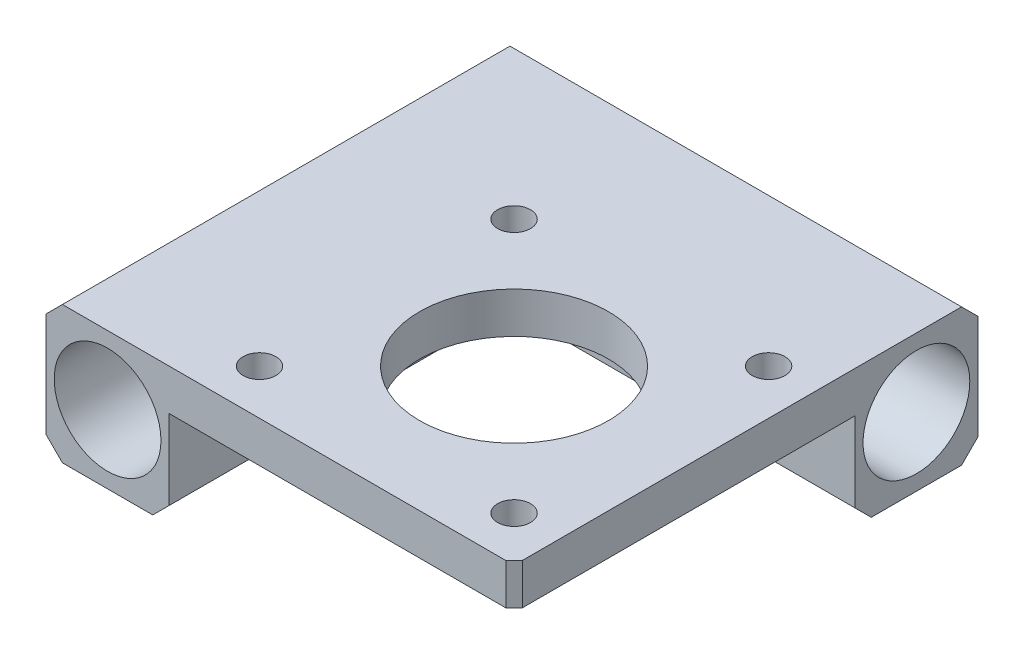
ISO-10303-21;
HEADER;
FILE_DESCRIPTION(('STEP AP214'),'2;1');
FILE_NAME('part.step','',(''),(''),'','','');
FILE_SCHEMA(('AUTOMOTIVE_DESIGN { 1 0 10303 214 1 1 1 1 }'));
ENDSEC;
DATA;
#1=APPLICATION_CONTEXT('core data for automotive mechanical design processes');
#2=APPLICATION_PROTOCOL_DEFINITION('international standard','automotive_design',2000,#1);
#3=PRODUCT_CONTEXT('',#1,'mechanical');
#4=PRODUCT('Part','Part','',(#3));
#5=PRODUCT_RELATED_PRODUCT_CATEGORY('part','',(#4));
#6=PRODUCT_DEFINITION_FORMATION('','',#4);
#7=PRODUCT_DEFINITION_CONTEXT('part definition',#1,'design');
#8=PRODUCT_DEFINITION('design','',#6,#7);
#9=PRODUCT_DEFINITION_SHAPE('','',#8);
#10=(LENGTH_UNIT() NAMED_UNIT(*) SI_UNIT(.MILLI.,.METRE.));
#11=(NAMED_UNIT(*) PLANE_ANGLE_UNIT() SI_UNIT($,.RADIAN.));
#12=(NAMED_UNIT(*) SI_UNIT($,.STERADIAN.) SOLID_ANGLE_UNIT());
#13=UNCERTAINTY_MEASURE_WITH_UNIT(LENGTH_MEASURE(1.E-05),#10,'distance_accuracy_value','');
#14=(GEOMETRIC_REPRESENTATION_CONTEXT(3) GLOBAL_UNCERTAINTY_ASSIGNED_CONTEXT((#13)) GLOBAL_UNIT_ASSIGNED_CONTEXT((#10,
#11,#12)) REPRESENTATION_CONTEXT('',''));
#15=CARTESIAN_POINT('',(0.,0.,0.));
#16=DIRECTION('',(0.,0.,1.));
#17=DIRECTION('',(1.,0.,0.));
#18=AXIS2_PLACEMENT_3D('',#15,#16,#17);
#19=CARTESIAN_POINT('',(0.,11.7,0.));
#20=DIRECTION('',(0.,1.,0.));
#21=DIRECTION('',(0.,0.,1.));
#22=AXIS2_PLACEMENT_3D('',#19,#20,#21);
#23=PLANE('',#22);
#24=CARTESIAN_POINT('',(28.5,11.7,15.5));
#25=DIRECTION('',(0.,1.,0.));
#26=DIRECTION('',(0.,0.,1.));
#27=AXIS2_PLACEMENT_3D('',#24,#25,#26);
#28=CIRCLE('',#27,11.5);
#29=CARTESIAN_POINT('',(28.5,11.7,27.));
#30=VERTEX_POINT('',#29);
#31=EDGE_CURVE('E266',#30,#30,#28,.T.);
#32=ORIENTED_EDGE('',*,*,#31,.T.);
#33=EDGE_LOOP('',(#32));
#34=FACE_BOUND('',#33,.T.);
#35=CARTESIAN_POINT('',(44.,11.7,31.));
#36=DIRECTION('',(0.,1.,0.));
#37=DIRECTION('',(0.,0.,1.));
#38=AXIS2_PLACEMENT_3D('',#35,#36,#37);
#39=CIRCLE('',#38,2.);
#40=CARTESIAN_POINT('',(44.,11.7,33.));
#41=VERTEX_POINT('',#40);
#42=EDGE_CURVE('E252',#41,#41,#39,.T.);
#43=ORIENTED_EDGE('',*,*,#42,.T.);
#44=EDGE_LOOP('',(#43));
#45=FACE_BOUND('',#44,.T.);
#46=CARTESIAN_POINT('',(13.,11.7,0.));
#47=DIRECTION('',(0.,1.,0.));
#48=DIRECTION('',(0.,0.,1.));
#49=AXIS2_PLACEMENT_3D('',#46,#47,#48);
#50=CIRCLE('',#49,2.);
#51=CARTESIAN_POINT('',(13.,11.7,2.));
#52=VERTEX_POINT('',#51);
#53=EDGE_CURVE('E249',#52,#52,#50,.T.);
#54=ORIENTED_EDGE('',*,*,#53,.T.);
#55=EDGE_LOOP('',(#54));
#56=FACE_BOUND('',#55,.T.);
#57=CARTESIAN_POINT('',(13.,11.7,31.));
#58=DIRECTION('',(0.,1.,0.));
#59=DIRECTION('',(0.,0.,1.));
#60=AXIS2_PLACEMENT_3D('',#57,#58,#59);
#61=CIRCLE('',#60,2.);
#62=CARTESIAN_POINT('',(13.,11.7,33.));
#63=VERTEX_POINT('',#62);
#64=EDGE_CURVE('E246',#63,#63,#61,.T.);
#65=ORIENTED_EDGE('',*,*,#64,.T.);
#66=EDGE_LOOP('',(#65));
#67=FACE_BOUND('',#66,.T.);
#68=CARTESIAN_POINT('',(44.,11.7,0.));
#69=DIRECTION('',(0.,1.,0.));
#70=DIRECTION('',(0.,0.,1.));
#71=AXIS2_PLACEMENT_3D('',#68,#69,#70);
#72=CIRCLE('',#71,2.);
#73=CARTESIAN_POINT('',(44.,11.7,2.));
#74=VERTEX_POINT('',#73);
#75=EDGE_CURVE('E243',#74,#74,#72,.T.);
#76=ORIENTED_EDGE('',*,*,#75,.T.);
#77=EDGE_LOOP('',(#76));
#78=FACE_BOUND('',#77,.T.);
#79=DIRECTION('',(1.,0.,0.));
#80=VECTOR('',#79,1.);
#81=CARTESIAN_POINT('',(0.,11.7,-5.));
#82=LINE('',#81,#80);
#83=CARTESIAN_POINT('',(9.5,11.7,-5.));
#84=VERTEX_POINT('',#83);
#85=CARTESIAN_POINT('',(49.5,11.7,-5.));
#86=VERTEX_POINT('',#85);
#87=EDGE_CURVE('E260',#84,#86,#82,.T.);
#88=ORIENTED_EDGE('',*,*,#87,.T.);
#89=DIRECTION('',(0.,0.,-1.));
#90=VECTOR('',#89,1.);
#91=CARTESIAN_POINT('',(49.5,11.7,0.));
#92=LINE('',#91,#90);
#93=CARTESIAN_POINT('',(49.5,11.7,35.5));
#94=VERTEX_POINT('',#93);
#95=EDGE_CURVE('E258',#94,#86,#92,.T.);
#96=ORIENTED_EDGE('',*,*,#95,.F.);
#97=DIRECTION('',(0.707106781186548,0.,-0.707106781186548));
#98=VECTOR('',#97,1.);
#99=CARTESIAN_POINT('',(48.5,11.7,36.5));
#100=LINE('',#99,#98);
#101=CARTESIAN_POINT('',(48.5,11.7,36.5));
#102=VERTEX_POINT('',#101);
#103=EDGE_CURVE('E14',#94,#102,#100,.F.);
#104=ORIENTED_EDGE('',*,*,#103,.T.);
#105=DIRECTION('',(1.,0.,0.));
#106=VECTOR('',#105,1.);
#107=CARTESIAN_POINT('',(0.,11.7,36.5));
#108=LINE('',#107,#106);
#109=CARTESIAN_POINT('',(7.5,11.7,36.5));
#110=VERTEX_POINT('',#109);
#111=EDGE_CURVE('E255',#110,#102,#108,.T.);
#112=ORIENTED_EDGE('',*,*,#111,.F.);
#113=DIRECTION('',(0.,0.,-1.));
#114=VECTOR('',#113,1.);
#115=CARTESIAN_POINT('',(7.5,11.7,0.));
#116=LINE('',#115,#114);
#117=CARTESIAN_POINT('',(7.5,11.7,-3.));
#118=VERTEX_POINT('',#117);
#119=EDGE_CURVE('E264',#110,#118,#116,.T.);
#120=ORIENTED_EDGE('',*,*,#119,.T.);
#121=DIRECTION('',(0.707106781186548,0.,-0.707106781186548));
#122=VECTOR('',#121,1.);
#123=CARTESIAN_POINT('',(2.25,11.7,2.25));
#124=LINE('',#123,#122);
#125=EDGE_CURVE('E262',#118,#84,#124,.T.);
#126=ORIENTED_EDGE('',*,*,#125,.T.);
#127=EDGE_LOOP('',(#88,#96,#104,#112,#120,#126));
#128=FACE_BOUND('',#127,.T.);
#129=ADVANCED_FACE('F57',(#34,#45,#56,#67,#78,#128),#23,.F.);
#130=CARTESIAN_POINT('',(7.5,16.7,0.));
#131=DIRECTION('',(-1.,0.,0.));
#132=DIRECTION('',(0.,0.,1.));
#133=AXIS2_PLACEMENT_3D('',#130,#131,#132);
#134=PLANE('',#133);
#135=DIRECTION('',(0.,1.,0.));
#136=VECTOR('',#135,1.);
#137=CARTESIAN_POINT('',(7.5,16.7,-3.));
#138=LINE('',#137,#136);
#139=CARTESIAN_POINT('',(7.5,2.,-3.));
#140=VERTEX_POINT('',#139);
#141=EDGE_CURVE('E326',#140,#118,#138,.T.);
#142=ORIENTED_EDGE('',*,*,#141,.T.);
#143=ORIENTED_EDGE('',*,*,#119,.F.);
#144=DIRECTION('',(0.,1.,0.));
#145=VECTOR('',#144,1.);
#146=CARTESIAN_POINT('',(7.5,2.,36.5));
#147=LINE('',#146,#145);
#148=CARTESIAN_POINT('',(7.5,2.,36.5));
#149=VERTEX_POINT('',#148);
#150=EDGE_CURVE('E222',#149,#110,#147,.T.);
#151=ORIENTED_EDGE('',*,*,#150,.F.);
#152=DIRECTION('',(0.,0.,-1.));
#153=VECTOR('',#152,1.);
#154=CARTESIAN_POINT('',(7.5,2.,0.));
#155=LINE('',#154,#153);
#156=EDGE_CURVE('E329',#149,#140,#155,.T.);
#157=ORIENTED_EDGE('',*,*,#156,.T.);
#158=EDGE_LOOP('',(#142,#143,#151,#157));
#159=FACE_BOUND('',#158,.T.);
#160=ADVANCED_FACE('F427',(#159),#134,.F.);
#161=CARTESIAN_POINT('',(0.,16.7,-5.));
#162=DIRECTION('',(0.,0.,-1.));
#163=DIRECTION('',(-1.,0.,0.));
#164=AXIS2_PLACEMENT_3D('',#161,#162,#163);
#165=PLANE('',#164);
#166=ORIENTED_EDGE('',*,*,#87,.F.);
#167=DIRECTION('',(0.,-1.,0.));
#168=VECTOR('',#167,1.);
#169=CARTESIAN_POINT('',(9.5,0.,-5.));
#170=LINE('',#169,#168);
#171=CARTESIAN_POINT('',(9.5,2.,-5.));
#172=VERTEX_POINT('',#171);
#173=EDGE_CURVE('E332',#84,#172,#170,.T.);
#174=ORIENTED_EDGE('',*,*,#173,.T.);
#175=DIRECTION('',(1.,0.,0.));
#176=VECTOR('',#175,1.);
#177=CARTESIAN_POINT('',(0.,2.,-5.));
#178=LINE('',#177,#176);
#179=CARTESIAN_POINT('',(49.5,2.,-5.));
#180=VERTEX_POINT('',#179);
#181=EDGE_CURVE('E334',#172,#180,#178,.T.);
#182=ORIENTED_EDGE('',*,*,#181,.T.);
#183=DIRECTION('',(0.,-1.,0.));
#184=VECTOR('',#183,1.);
#185=CARTESIAN_POINT('',(49.5,15.7,-5.));
#186=LINE('',#185,#184);
#187=EDGE_CURVE('E218',#86,#180,#186,.T.);
#188=ORIENTED_EDGE('',*,*,#187,.F.);
#189=EDGE_LOOP('',(#166,#174,#182,#188));
#190=FACE_BOUND('',#189,.T.);
#191=ADVANCED_FACE('F433',(#190),#165,.F.);
#192=CARTESIAN_POINT('',(9.5,16.7,-5.));
#193=DIRECTION('',(0.707106781186548,0.,0.707106781186548));
#194=DIRECTION('',(0.,1.,0.));
#195=AXIS2_PLACEMENT_3D('',#192,#193,#194);
#196=PLANE('',#195);
#197=ORIENTED_EDGE('',*,*,#125,.F.);
#198=ORIENTED_EDGE('',*,*,#141,.F.);
#199=DIRECTION('',(0.707106781186548,0.,-0.707106781186548));
#200=VECTOR('',#199,1.);
#201=CARTESIAN_POINT('',(9.5,2.,-5.));
#202=LINE('',#201,#200);
#203=EDGE_CURVE('E347',#172,#140,#202,.F.);
#204=ORIENTED_EDGE('',*,*,#203,.F.);
#205=ORIENTED_EDGE('',*,*,#173,.F.);
#206=EDGE_LOOP('',(#197,#198,#204,#205));
#207=FACE_BOUND('',#206,.T.);
#208=ADVANCED_FACE('F432',(#207),#196,.T.);
#209=CARTESIAN_POINT('',(0.,0.,0.));
#210=DIRECTION('',(0.,1.,0.));
#211=DIRECTION('',(0.,0.,1.));
#212=AXIS2_PLACEMENT_3D('',#209,#210,#211);
#213=PLANE('',#212);
#214=DIRECTION('',(0.,0.,1.));
#215=VECTOR('',#214,1.);
#216=CARTESIAN_POINT('',(5.5,0.,0.));
#217=LINE('',#216,#215);
#218=CARTESIAN_POINT('',(5.5,0.,-3.));
#219=VERTEX_POINT('',#218);
#220=CARTESIAN_POINT('',(5.5,0.,36.5));
#221=VERTEX_POINT('',#220);
#222=EDGE_CURVE('E311',#219,#221,#217,.T.);
#223=ORIENTED_EDGE('',*,*,#222,.T.);
#224=DIRECTION('',(1.,0.,0.));
#225=VECTOR('',#224,1.);
#226=CARTESIAN_POINT('',(-5.5,0.,36.5));
#227=LINE('',#226,#225);
#228=CARTESIAN_POINT('',(-5.5,0.,36.5));
#229=VERTEX_POINT('',#228);
#230=EDGE_CURVE('E228',#229,#221,#227,.T.);
#231=ORIENTED_EDGE('',*,*,#230,.F.);
#232=DIRECTION('',(0.,0.,-1.));
#233=VECTOR('',#232,1.);
#234=CARTESIAN_POINT('',(-5.49999999999999,0.,-20.));
#235=LINE('',#234,#233);
#236=CARTESIAN_POINT('',(-5.49999999999999,0.,-9.03589838486224));
#237=VERTEX_POINT('',#236);
#238=EDGE_CURVE('E313',#229,#237,#235,.T.);
#239=ORIENTED_EDGE('',*,*,#238,.T.);
#240=CARTESIAN_POINT('',(0.,0.,-12.5));
#241=DIRECTION('',(0.,-1.,0.));
#242=DIRECTION('',(0.,0.,-1.));
#243=AXIS2_PLACEMENT_3D('',#240,#241,#242);
#244=CIRCLE('',#243,6.5);
#245=CARTESIAN_POINT('',(3.46410161513776,0.,-18.));
#246=VERTEX_POINT('',#245);
#247=EDGE_CURVE('E284',#246,#237,#244,.T.);
#248=ORIENTED_EDGE('',*,*,#247,.F.);
#249=DIRECTION('',(1.,0.,0.));
#250=VECTOR('',#249,1.);
#251=CARTESIAN_POINT('',(17.5,0.,-18.));
#252=LINE('',#251,#250);
#253=CARTESIAN_POINT('',(49.5,0.,-18.));
#254=VERTEX_POINT('',#253);
#255=EDGE_CURVE('E297',#246,#254,#252,.T.);
#256=ORIENTED_EDGE('',*,*,#255,.T.);
#257=DIRECTION('',(0.,0.,-1.));
#258=VECTOR('',#257,1.);
#259=CARTESIAN_POINT('',(49.5,0.,-7.));
#260=LINE('',#259,#258);
#261=CARTESIAN_POINT('',(49.5,0.,-7.));
#262=VERTEX_POINT('',#261);
#263=EDGE_CURVE('E212',#262,#254,#260,.T.);
#264=ORIENTED_EDGE('',*,*,#263,.F.);
#265=DIRECTION('',(-1.,0.,0.));
#266=VECTOR('',#265,1.);
#267=CARTESIAN_POINT('',(0.,0.,-7.));
#268=LINE('',#267,#266);
#269=CARTESIAN_POINT('',(9.5,0.,-7.));
#270=VERTEX_POINT('',#269);
#271=EDGE_CURVE('E309',#262,#270,#268,.T.);
#272=ORIENTED_EDGE('',*,*,#271,.T.);
#273=DIRECTION('',(0.707106781186548,0.,-0.707106781186548));
#274=VECTOR('',#273,1.);
#275=CARTESIAN_POINT('',(9.5,0.,-7.));
#276=LINE('',#275,#274);
#277=CARTESIAN_POINT('',(7.5,0.,-5.));
#278=VERTEX_POINT('',#277);
#279=EDGE_CURVE('E303',#278,#270,#276,.T.);
#280=ORIENTED_EDGE('',*,*,#279,.F.);
#281=DIRECTION('',(0.707106781186548,0.,-0.707106781186548));
#282=VECTOR('',#281,1.);
#283=CARTESIAN_POINT('',(9.5,0.,-7.));
#284=LINE('',#283,#282);
#285=EDGE_CURVE('E306',#219,#278,#284,.T.);
#286=ORIENTED_EDGE('',*,*,#285,.F.);
#287=EDGE_LOOP('',(#223,#231,#239,#248,#256,#264,#272,#280,#286));
#288=FACE_BOUND('',#287,.T.);
#289=ADVANCED_FACE('F388',(#288),#213,.F.);
#290=CARTESIAN_POINT('',(-7.5,16.7,0.));
#291=DIRECTION('',(-1.,0.,0.));
#292=DIRECTION('',(0.,0.,1.));
#293=AXIS2_PLACEMENT_3D('',#290,#291,#292);
#294=PLANE('',#293);
#295=DIRECTION('',(0.,-1.,0.));
#296=VECTOR('',#295,1.);
#297=CARTESIAN_POINT('',(-7.49999999999999,16.7,-18.));
#298=LINE('',#297,#296);
#299=CARTESIAN_POINT('',(-7.49999999999999,14.7,-18.));
#300=VERTEX_POINT('',#299);
#301=CARTESIAN_POINT('',(-7.49999999999999,2.,-18.));
#302=VERTEX_POINT('',#301);
#303=EDGE_CURVE('E320',#300,#302,#298,.T.);
#304=ORIENTED_EDGE('',*,*,#303,.T.);
#305=DIRECTION('',(0.,0.,1.));
#306=VECTOR('',#305,1.);
#307=CARTESIAN_POINT('',(-7.5,2.,5.));
#308=LINE('',#307,#306);
#309=CARTESIAN_POINT('',(-7.5,2.,36.5));
#310=VERTEX_POINT('',#309);
#311=EDGE_CURVE('E191',#302,#310,#308,.T.);
#312=ORIENTED_EDGE('',*,*,#311,.T.);
#313=DIRECTION('',(0.,-1.,0.));
#314=VECTOR('',#313,1.);
#315=CARTESIAN_POINT('',(-7.5,14.7,36.5));
#316=LINE('',#315,#314);
#317=CARTESIAN_POINT('',(-7.5,14.7,36.5));
#318=VERTEX_POINT('',#317);
#319=EDGE_CURVE('E234',#318,#310,#316,.T.);
#320=ORIENTED_EDGE('',*,*,#319,.F.);
#321=DIRECTION('',(0.,0.,-1.));
#322=VECTOR('',#321,1.);
#323=CARTESIAN_POINT('',(-7.5,14.7,0.));
#324=LINE('',#323,#322);
#325=EDGE_CURVE('E322',#318,#300,#324,.T.);
#326=ORIENTED_EDGE('',*,*,#325,.T.);
#327=EDGE_LOOP('',(#304,#312,#320,#326));
#328=FACE_BOUND('',#327,.T.);
#329=ADVANCED_FACE('F410',(#328),#294,.T.);
#330=CARTESIAN_POINT('',(0.,16.7,-20.));
#331=DIRECTION('',(0.,0.,-1.));
#332=DIRECTION('',(-1.,0.,0.));
#333=AXIS2_PLACEMENT_3D('',#330,#331,#332);
#334=PLANE('',#333);
#335=DIRECTION('',(0.,1.,0.));
#336=VECTOR('',#335,1.);
#337=CARTESIAN_POINT('',(-5.49999999999999,16.7,-20.));
#338=LINE('',#337,#336);
#339=CARTESIAN_POINT('',(-5.49999999999999,2.,-20.));
#340=VERTEX_POINT('',#339);
#341=CARTESIAN_POINT('',(-5.49999999999999,14.7,-20.));
#342=VERTEX_POINT('',#341);
#343=EDGE_CURVE('E336',#340,#342,#338,.T.);
#344=ORIENTED_EDGE('',*,*,#343,.T.);
#345=DIRECTION('',(1.,0.,0.));
#346=VECTOR('',#345,1.);
#347=CARTESIAN_POINT('',(0.,14.7,-20.));
#348=LINE('',#347,#346);
#349=CARTESIAN_POINT('',(49.5,14.7,-20.));
#350=VERTEX_POINT('',#349);
#351=EDGE_CURVE('E340',#342,#350,#348,.T.);
#352=ORIENTED_EDGE('',*,*,#351,.T.);
#353=DIRECTION('',(0.,1.,0.));
#354=VECTOR('',#353,1.);
#355=CARTESIAN_POINT('',(49.5,2.,-20.));
#356=LINE('',#355,#354);
#357=CARTESIAN_POINT('',(49.5,2.,-20.));
#358=VERTEX_POINT('',#357);
#359=EDGE_CURVE('E203',#358,#350,#356,.T.);
#360=ORIENTED_EDGE('',*,*,#359,.F.);
#361=DIRECTION('',(-1.,0.,0.));
#362=VECTOR('',#361,1.);
#363=CARTESIAN_POINT('',(-7.5,2.,-20.));
#364=LINE('',#363,#362);
#365=EDGE_CURVE('E338',#358,#340,#364,.T.);
#366=ORIENTED_EDGE('',*,*,#365,.T.);
#367=EDGE_LOOP('',(#344,#352,#360,#366));
#368=FACE_BOUND('',#367,.T.);
#369=ADVANCED_FACE('F399',(#368),#334,.T.);
#370=CARTESIAN_POINT('',(0.,16.7,0.));
#371=DIRECTION('',(0.,1.,0.));
#372=DIRECTION('',(0.,0.,1.));
#373=AXIS2_PLACEMENT_3D('',#370,#371,#372);
#374=PLANE('',#373);
#375=DIRECTION('',(0.,0.,-1.));
#376=VECTOR('',#375,1.);
#377=CARTESIAN_POINT('',(49.5,16.7,0.));
#378=LINE('',#377,#376);
#379=CARTESIAN_POINT('',(49.5,16.7,35.5));
#380=VERTEX_POINT('',#379);
#381=CARTESIAN_POINT('',(49.5,16.7,-18.));
#382=VERTEX_POINT('',#381);
#383=EDGE_CURVE('E193',#380,#382,#378,.T.);
#384=ORIENTED_EDGE('',*,*,#383,.T.);
#385=DIRECTION('',(-1.,0.,0.));
#386=VECTOR('',#385,1.);
#387=CARTESIAN_POINT('',(0.,16.7,-18.));
#388=LINE('',#387,#386);
#389=CARTESIAN_POINT('',(-5.49999999999999,16.7,-18.));
#390=VERTEX_POINT('',#389);
#391=EDGE_CURVE('E180',#382,#390,#388,.T.);
#392=ORIENTED_EDGE('',*,*,#391,.T.);
#393=DIRECTION('',(0.,0.,1.));
#394=VECTOR('',#393,1.);
#395=CARTESIAN_POINT('',(-5.49999999999999,16.7,0.));
#396=LINE('',#395,#394);
#397=CARTESIAN_POINT('',(-5.49999999999999,16.7,36.5));
#398=VERTEX_POINT('',#397);
#399=EDGE_CURVE('E190',#390,#398,#396,.T.);
#400=ORIENTED_EDGE('',*,*,#399,.T.);
#401=DIRECTION('',(1.,0.,0.));
#402=VECTOR('',#401,1.);
#403=CARTESIAN_POINT('',(0.,16.7,36.5));
#404=LINE('',#403,#402);
#405=CARTESIAN_POINT('',(48.5,16.7,36.5));
#406=VERTEX_POINT('',#405);
#407=EDGE_CURVE('E197',#398,#406,#404,.T.);
#408=ORIENTED_EDGE('',*,*,#407,.T.);
#409=DIRECTION('',(-0.707106781186548,0.,0.707106781186548));
#410=VECTOR('',#409,1.);
#411=CARTESIAN_POINT('',(42.5,16.7,42.5));
#412=LINE('',#411,#410);
#413=EDGE_CURVE('E80',#406,#380,#412,.F.);
#414=ORIENTED_EDGE('',*,*,#413,.T.);
#415=EDGE_LOOP('',(#384,#392,#400,#408,#414));
#416=FACE_BOUND('',#415,.T.);
#417=CARTESIAN_POINT('',(44.,16.7,0.));
#418=DIRECTION('',(0.,1.,0.));
#419=DIRECTION('',(0.,0.,1.));
#420=AXIS2_PLACEMENT_3D('',#417,#418,#419);
#421=CIRCLE('',#420,2.);
#422=CARTESIAN_POINT('',(44.,16.7,2.));
#423=VERTEX_POINT('',#422);
#424=EDGE_CURVE('E240',#423,#423,#421,.T.);
#425=ORIENTED_EDGE('',*,*,#424,.F.);
#426=EDGE_LOOP('',(#425));
#427=FACE_BOUND('',#426,.T.);
#428=CARTESIAN_POINT('',(13.,16.7,31.));
#429=DIRECTION('',(0.,1.,0.));
#430=DIRECTION('',(0.,0.,1.));
#431=AXIS2_PLACEMENT_3D('',#428,#429,#430);
#432=CIRCLE('',#431,2.);
#433=CARTESIAN_POINT('',(13.,16.7,33.));
#434=VERTEX_POINT('',#433);
#435=EDGE_CURVE('E272',#434,#434,#432,.T.);
#436=ORIENTED_EDGE('',*,*,#435,.F.);
#437=EDGE_LOOP('',(#436));
#438=FACE_BOUND('',#437,.T.);
#439=CARTESIAN_POINT('',(13.,16.7,0.));
#440=DIRECTION('',(0.,1.,0.));
#441=DIRECTION('',(0.,0.,1.));
#442=AXIS2_PLACEMENT_3D('',#439,#440,#441);
#443=CIRCLE('',#442,2.);
#444=CARTESIAN_POINT('',(13.,16.7,2.));
#445=VERTEX_POINT('',#444);
#446=EDGE_CURVE('E275',#445,#445,#443,.T.);
#447=ORIENTED_EDGE('',*,*,#446,.F.);
#448=EDGE_LOOP('',(#447));
#449=FACE_BOUND('',#448,.T.);
#450=CARTESIAN_POINT('',(44.,16.7,31.));
#451=DIRECTION('',(0.,1.,0.));
#452=DIRECTION('',(0.,0.,1.));
#453=AXIS2_PLACEMENT_3D('',#450,#451,#452);
#454=CIRCLE('',#453,2.);
#455=CARTESIAN_POINT('',(44.,16.7,33.));
#456=VERTEX_POINT('',#455);
#457=EDGE_CURVE('E278',#456,#456,#454,.T.);
#458=ORIENTED_EDGE('',*,*,#457,.F.);
#459=EDGE_LOOP('',(#458));
#460=FACE_BOUND('',#459,.T.);
#461=CARTESIAN_POINT('',(28.5,16.7,15.5));
#462=DIRECTION('',(0.,1.,0.));
#463=DIRECTION('',(0.,0.,1.));
#464=AXIS2_PLACEMENT_3D('',#461,#462,#463);
#465=CIRCLE('',#464,11.5);
#466=CARTESIAN_POINT('',(28.5,16.7,27.));
#467=VERTEX_POINT('',#466);
#468=EDGE_CURVE('E196',#467,#467,#465,.T.);
#469=ORIENTED_EDGE('',*,*,#468,.F.);
#470=EDGE_LOOP('',(#469));
#471=FACE_BOUND('',#470,.T.);
#472=ADVANCED_FACE('F194',(#416,#427,#438,#449,#460,#471),#374,.T.);
#473=CARTESIAN_POINT('',(-5.49999999999999,0.,-15.9641016151378));
#474=VERTEX_POINT('',#473);
#475=CARTESIAN_POINT('',(-3.46410161513776,0.,-18.));
#476=VERTEX_POINT('',#475);
#477=EDGE_CURVE('E288',#474,#476,#244,.T.);
#478=ORIENTED_EDGE('',*,*,#477,.F.);
#479=DIRECTION('',(0.,0.,-1.));
#480=VECTOR('',#479,1.);
#481=CARTESIAN_POINT('',(-5.49999999999999,0.,-20.));
#482=LINE('',#481,#480);
#483=CARTESIAN_POINT('',(-5.49999999999999,0.,-18.));
#484=VERTEX_POINT('',#483);
#485=EDGE_CURVE('E301',#474,#484,#482,.T.);
#486=ORIENTED_EDGE('',*,*,#485,.T.);
#487=DIRECTION('',(1.,0.,0.));
#488=VECTOR('',#487,1.);
#489=CARTESIAN_POINT('',(17.5,0.,-18.));
#490=LINE('',#489,#488);
#491=EDGE_CURVE('E299',#484,#476,#490,.T.);
#492=ORIENTED_EDGE('',*,*,#491,.T.);
#493=EDGE_LOOP('',(#478,#486,#492));
#494=FACE_BOUND('',#493,.T.);
#495=ADVANCED_FACE('F482',(#494),#213,.F.);
#496=CARTESIAN_POINT('',(0.,14.7,0.));
#497=DIRECTION('',(0.,1.,0.));
#498=DIRECTION('',(0.,0.,1.));
#499=AXIS2_PLACEMENT_3D('',#496,#497,#498);
#500=PLANE('',#499);
#501=CARTESIAN_POINT('',(0.,14.7,-12.5));
#502=DIRECTION('',(0.,1.,0.));
#503=DIRECTION('',(0.,0.,1.));
#504=AXIS2_PLACEMENT_3D('',#501,#502,#503);
#505=CIRCLE('',#504,6.5);
#506=CARTESIAN_POINT('',(0.,14.7,-6.00000000000001));
#507=VERTEX_POINT('',#506);
#508=EDGE_CURVE('E287',#507,#507,#505,.F.);
#509=ORIENTED_EDGE('',*,*,#508,.T.);
#510=EDGE_LOOP('',(#509));
#511=FACE_BOUND('',#510,.T.);
#512=ADVANCED_FACE('F478',(#511),#500,.F.);
#513=CARTESIAN_POINT('',(0.,35.0847763108502,-12.5));
#514=DIRECTION('',(0.,-1.,0.));
#515=DIRECTION('',(0.,0.,-1.));
#516=AXIS2_PLACEMENT_3D('',#513,#514,#515);
#517=CYLINDRICAL_SURFACE('',#516,6.5);
#518=ORIENTED_EDGE('',*,*,#247,.T.);
#519=CARTESIAN_POINT('',(0.,-5.49999999999999,-12.5));
#520=DIRECTION('',(-0.707106781186547,-0.707106781186548,0.));
#521=DIRECTION('',(0.707106781186548,-0.707106781186547,0.));
#522=AXIS2_PLACEMENT_3D('',#519,#520,#521);
#523=ELLIPSE('',#522,9.19238815542512,6.5);
#524=EDGE_CURVE('E318',#237,#474,#523,.T.);
#525=ORIENTED_EDGE('',*,*,#524,.T.);
#526=ORIENTED_EDGE('',*,*,#477,.T.);
#527=CARTESIAN_POINT('',(0.,-5.5,-12.5));
#528=DIRECTION('',(0.,-0.707106781186547,-0.707106781186548));
#529=DIRECTION('',(0.,-0.707106781186548,0.707106781186547));
#530=AXIS2_PLACEMENT_3D('',#527,#528,#529);
#531=ELLIPSE('',#530,9.19238815542512,6.5);
#532=EDGE_CURVE('E316',#476,#246,#531,.T.);
#533=ORIENTED_EDGE('',*,*,#532,.T.);
#534=EDGE_LOOP('',(#518,#525,#526,#533));
#535=FACE_BOUND('',#534,.T.);
#536=ORIENTED_EDGE('',*,*,#508,.F.);
#537=EDGE_LOOP('',(#536));
#538=FACE_BOUND('',#537,.T.);
#539=ADVANCED_FACE('F475',(#535,#538),#517,.F.);
#540=CARTESIAN_POINT('',(0.,14.7,-20.));
#541=DIRECTION('',(0.,-0.707106781186547,0.707106781186548));
#542=DIRECTION('',(1.,0.,0.));
#543=AXIS2_PLACEMENT_3D('',#540,#541,#542);
#544=PLANE('',#543);
#545=ORIENTED_EDGE('',*,*,#391,.F.);
#546=DIRECTION('',(0.,0.707106781186547,0.707106781186548));
#547=VECTOR('',#546,1.);
#548=CARTESIAN_POINT('',(49.5,14.7,-20.));
#549=LINE('',#548,#547);
#550=EDGE_CURVE('E184',#350,#382,#549,.T.);
#551=ORIENTED_EDGE('',*,*,#550,.F.);
#552=ORIENTED_EDGE('',*,*,#351,.F.);
#553=DIRECTION('',(0.,0.707106781186548,0.707106781186547));
#554=VECTOR('',#553,1.);
#555=CARTESIAN_POINT('',(-5.49999999999999,15.7,-19.));
#556=LINE('',#555,#554);
#557=EDGE_CURVE('E187',#390,#342,#556,.F.);
#558=ORIENTED_EDGE('',*,*,#557,.F.);
#559=EDGE_LOOP('',(#545,#551,#552,#558));
#560=FACE_BOUND('',#559,.T.);
#561=ADVANCED_FACE('F181',(#560),#544,.F.);
#562=CARTESIAN_POINT('',(-7.5,14.7,0.));
#563=DIRECTION('',(0.707106781186547,-0.707106781186548,0.));
#564=DIRECTION('',(0.,0.,-1.));
#565=AXIS2_PLACEMENT_3D('',#562,#563,#564);
#566=PLANE('',#565);
#567=ORIENTED_EDGE('',*,*,#325,.F.);
#568=DIRECTION('',(-0.707106781186548,-0.707106781186547,0.));
#569=VECTOR('',#568,1.);
#570=CARTESIAN_POINT('',(-5.49999999999999,16.7,36.5));
#571=LINE('',#570,#569);
#572=EDGE_CURVE('E237',#398,#318,#571,.T.);
#573=ORIENTED_EDGE('',*,*,#572,.F.);
#574=ORIENTED_EDGE('',*,*,#399,.F.);
#575=DIRECTION('',(-0.707106781186548,-0.707106781186547,0.));
#576=VECTOR('',#575,1.);
#577=CARTESIAN_POINT('',(-7.49999999999999,14.7,-18.));
#578=LINE('',#577,#576);
#579=EDGE_CURVE('E356',#300,#390,#578,.F.);
#580=ORIENTED_EDGE('',*,*,#579,.F.);
#581=EDGE_LOOP('',(#567,#573,#574,#580));
#582=FACE_BOUND('',#581,.T.);
#583=ADVANCED_FACE('F414',(#582),#566,.F.);
#584=CARTESIAN_POINT('',(-7.49999999999999,14.7,-18.));
#585=DIRECTION('',(-0.577350269189626,0.577350269189626,-0.577350269189626));
#586=DIRECTION('',(0.,0.707106781186548,0.707106781186547));
#587=AXIS2_PLACEMENT_3D('',#584,#585,#586);
#588=PLANE('',#587);
#589=ORIENTED_EDGE('',*,*,#579,.T.);
#590=ORIENTED_EDGE('',*,*,#557,.T.);
#591=DIRECTION('',(0.707106781186548,0.,-0.707106781186547));
#592=VECTOR('',#591,1.);
#593=CARTESIAN_POINT('',(-7.49999999999999,14.7,-18.));
#594=LINE('',#593,#592);
#595=EDGE_CURVE('E353',#300,#342,#594,.T.);
#596=ORIENTED_EDGE('',*,*,#595,.F.);
#597=EDGE_LOOP('',(#589,#590,#596));
#598=FACE_BOUND('',#597,.T.);
#599=ADVANCED_FACE('F402',(#598),#588,.T.);
#600=CARTESIAN_POINT('',(0.,0.,-18.));
#601=DIRECTION('',(0.,-0.707106781186547,-0.707106781186548));
#602=DIRECTION('',(-1.,0.,0.));
#603=AXIS2_PLACEMENT_3D('',#600,#601,#602);
#604=PLANE('',#603);
#605=ORIENTED_EDGE('',*,*,#532,.F.);
#606=ORIENTED_EDGE('',*,*,#491,.F.);
#607=DIRECTION('',(0.,-0.707106781186548,0.707106781186547));
#608=VECTOR('',#607,1.);
#609=CARTESIAN_POINT('',(-5.49999999999999,0.,-18.));
#610=LINE('',#609,#608);
#611=EDGE_CURVE('E350',#340,#484,#610,.T.);
#612=ORIENTED_EDGE('',*,*,#611,.F.);
#613=ORIENTED_EDGE('',*,*,#365,.F.);
#614=DIRECTION('',(0.,0.707106781186547,-0.707106781186548));
#615=VECTOR('',#614,1.);
#616=CARTESIAN_POINT('',(49.5,0.,-18.));
#617=LINE('',#616,#615);
#618=EDGE_CURVE('E206',#254,#358,#617,.T.);
#619=ORIENTED_EDGE('',*,*,#618,.F.);
#620=ORIENTED_EDGE('',*,*,#255,.F.);
#621=EDGE_LOOP('',(#605,#606,#612,#613,#619,#620));
#622=FACE_BOUND('',#621,.T.);
#623=ADVANCED_FACE('F394',(#622),#604,.T.);
#624=CARTESIAN_POINT('',(-7.49999999999999,16.7,-18.));
#625=DIRECTION('',(0.707106781186547,0.,0.707106781186548));
#626=DIRECTION('',(0.,-1.,0.));
#627=AXIS2_PLACEMENT_3D('',#624,#625,#626);
#628=PLANE('',#627);
#629=ORIENTED_EDGE('',*,*,#595,.T.);
#630=ORIENTED_EDGE('',*,*,#343,.F.);
#631=DIRECTION('',(-0.707106781186548,0.,0.707106781186547));
#632=VECTOR('',#631,1.);
#633=CARTESIAN_POINT('',(-6.49999999999999,2.,-19.));
#634=LINE('',#633,#632);
#635=EDGE_CURVE('E346',#302,#340,#634,.F.);
#636=ORIENTED_EDGE('',*,*,#635,.F.);
#637=ORIENTED_EDGE('',*,*,#303,.F.);
#638=EDGE_LOOP('',(#629,#630,#636,#637));
#639=FACE_BOUND('',#638,.T.);
#640=ADVANCED_FACE('F406',(#639),#628,.F.);
#641=CARTESIAN_POINT('',(-5.49999999999999,0.,-18.));
#642=DIRECTION('',(-0.577350269189626,-0.577350269189626,-0.577350269189626));
#643=DIRECTION('',(0.,0.707106781186548,-0.707106781186547));
#644=AXIS2_PLACEMENT_3D('',#641,#642,#643);
#645=PLANE('',#644);
#646=ORIENTED_EDGE('',*,*,#635,.T.);
#647=ORIENTED_EDGE('',*,*,#611,.T.);
#648=DIRECTION('',(-0.707106781186548,0.707106781186547,0.));
#649=VECTOR('',#648,1.);
#650=CARTESIAN_POINT('',(-5.49999999999999,0.,-18.));
#651=LINE('',#650,#649);
#652=EDGE_CURVE('E343',#302,#484,#651,.F.);
#653=ORIENTED_EDGE('',*,*,#652,.F.);
#654=EDGE_LOOP('',(#646,#647,#653));
#655=FACE_BOUND('',#654,.T.);
#656=ADVANCED_FACE('F519',(#655),#645,.T.);
#657=CARTESIAN_POINT('',(-5.49999999999999,0.,0.));
#658=DIRECTION('',(-0.707106781186547,-0.707106781186548,0.));
#659=DIRECTION('',(0.,0.,1.));
#660=AXIS2_PLACEMENT_3D('',#657,#658,#659);
#661=PLANE('',#660);
#662=ORIENTED_EDGE('',*,*,#238,.F.);
#663=DIRECTION('',(0.707106781186548,-0.707106781186547,0.));
#664=VECTOR('',#663,1.);
#665=CARTESIAN_POINT('',(-7.5,2.,36.5));
#666=LINE('',#665,#664);
#667=EDGE_CURVE('E231',#310,#229,#666,.T.);
#668=ORIENTED_EDGE('',*,*,#667,.F.);
#669=ORIENTED_EDGE('',*,*,#311,.F.);
#670=ORIENTED_EDGE('',*,*,#652,.T.);
#671=ORIENTED_EDGE('',*,*,#485,.F.);
#672=ORIENTED_EDGE('',*,*,#524,.F.);
#673=EDGE_LOOP('',(#662,#668,#669,#670,#671,#672));
#674=FACE_BOUND('',#673,.T.);
#675=ADVANCED_FACE('F417',(#674),#661,.T.);
#676=CARTESIAN_POINT('',(0.,2.,-5.));
#677=DIRECTION('',(0.,0.707106781186548,-0.707106781186548));
#678=DIRECTION('',(1.,0.,0.));
#679=AXIS2_PLACEMENT_3D('',#676,#677,#678);
#680=PLANE('',#679);
#681=ORIENTED_EDGE('',*,*,#271,.F.);
#682=DIRECTION('',(0.,-0.707106781186548,-0.707106781186548));
#683=VECTOR('',#682,1.);
#684=CARTESIAN_POINT('',(49.5,2.,-5.));
#685=LINE('',#684,#683);
#686=EDGE_CURVE('E215',#180,#262,#685,.T.);
#687=ORIENTED_EDGE('',*,*,#686,.F.);
#688=ORIENTED_EDGE('',*,*,#181,.F.);
#689=DIRECTION('',(0.,0.707106781186548,0.707106781186548));
#690=VECTOR('',#689,1.);
#691=CARTESIAN_POINT('',(9.5,0.,-7.));
#692=LINE('',#691,#690);
#693=EDGE_CURVE('E360',#270,#172,#692,.T.);
#694=ORIENTED_EDGE('',*,*,#693,.F.);
#695=EDGE_LOOP('',(#681,#687,#688,#694));
#696=FACE_BOUND('',#695,.T.);
#697=ADVANCED_FACE('F383',(#696),#680,.F.);
#698=CARTESIAN_POINT('',(9.5,2.,-5.));
#699=DIRECTION('',(0.577350269189626,-0.577350269189626,0.577350269189626));
#700=DIRECTION('',(0.707106781186547,0.,-0.707106781186547));
#701=AXIS2_PLACEMENT_3D('',#698,#699,#700);
#702=PLANE('',#701);
#703=ORIENTED_EDGE('',*,*,#693,.T.);
#704=ORIENTED_EDGE('',*,*,#203,.T.);
#705=DIRECTION('',(-0.707106781186548,-0.707106781186548,0.));
#706=VECTOR('',#705,1.);
#707=CARTESIAN_POINT('',(7.5,2.,-3.));
#708=LINE('',#707,#706);
#709=EDGE_CURVE('E269',#219,#140,#708,.F.);
#710=ORIENTED_EDGE('',*,*,#709,.F.);
#711=ORIENTED_EDGE('',*,*,#285,.T.);
#712=ORIENTED_EDGE('',*,*,#279,.T.);
#713=EDGE_LOOP('',(#703,#704,#710,#711,#712));
#714=FACE_BOUND('',#713,.T.);
#715=ADVANCED_FACE('F555',(#714),#702,.T.);
#716=CARTESIAN_POINT('',(7.5,2.,0.));
#717=DIRECTION('',(-0.707106781186548,0.707106781186548,0.));
#718=DIRECTION('',(0.,0.,-1.));
#719=AXIS2_PLACEMENT_3D('',#716,#717,#718);
#720=PLANE('',#719);
#721=ORIENTED_EDGE('',*,*,#156,.F.);
#722=DIRECTION('',(0.707106781186548,0.707106781186548,0.));
#723=VECTOR('',#722,1.);
#724=CARTESIAN_POINT('',(5.5,0.,36.5));
#725=LINE('',#724,#723);
#726=EDGE_CURVE('E225',#221,#149,#725,.T.);
#727=ORIENTED_EDGE('',*,*,#726,.F.);
#728=ORIENTED_EDGE('',*,*,#222,.F.);
#729=ORIENTED_EDGE('',*,*,#709,.T.);
#730=EDGE_LOOP('',(#721,#727,#728,#729));
#731=FACE_BOUND('',#730,.T.);
#732=ADVANCED_FACE('F424',(#731),#720,.F.);
#733=CARTESIAN_POINT('',(0.,11.7,36.5));
#734=DIRECTION('',(0.,0.,1.));
#735=DIRECTION('',(1.,0.,0.));
#736=AXIS2_PLACEMENT_3D('',#733,#734,#735);
#737=PLANE('',#736);
#738=DIRECTION('',(0.,1.,0.));
#739=VECTOR('',#738,1.);
#740=CARTESIAN_POINT('',(48.5,11.7,36.5));
#741=LINE('',#740,#739);
#742=EDGE_CURVE('E342',#102,#406,#741,.T.);
#743=ORIENTED_EDGE('',*,*,#742,.T.);
#744=ORIENTED_EDGE('',*,*,#407,.F.);
#745=ORIENTED_EDGE('',*,*,#572,.T.);
#746=ORIENTED_EDGE('',*,*,#319,.T.);
#747=ORIENTED_EDGE('',*,*,#667,.T.);
#748=ORIENTED_EDGE('',*,*,#230,.T.);
#749=ORIENTED_EDGE('',*,*,#726,.T.);
#750=ORIENTED_EDGE('',*,*,#150,.T.);
#751=ORIENTED_EDGE('',*,*,#111,.T.);
#752=EDGE_LOOP('',(#743,#744,#745,#746,#747,#748,#749,#750,#751));
#753=FACE_BOUND('',#752,.T.);
#754=CARTESIAN_POINT('',(0.,8.35,36.5));
#755=DIRECTION('',(0.,0.,1.));
#756=DIRECTION('',(1.,0.,0.));
#757=AXIS2_PLACEMENT_3D('',#754,#755,#756);
#758=CIRCLE('',#757,6.5);
#759=CARTESIAN_POINT('',(6.5,8.35,36.5));
#760=VERTEX_POINT('',#759);
#761=EDGE_CURVE('E220',#760,#760,#758,.T.);
#762=ORIENTED_EDGE('',*,*,#761,.F.);
#763=EDGE_LOOP('',(#762));
#764=FACE_BOUND('',#763,.T.);
#765=ADVANCED_FACE('F370',(#753,#764),#737,.T.);
#766=CARTESIAN_POINT('',(49.5,11.7,0.));
#767=DIRECTION('',(1.,0.,0.));
#768=DIRECTION('',(0.,0.,-1.));
#769=AXIS2_PLACEMENT_3D('',#766,#767,#768);
#770=PLANE('',#769);
#771=ORIENTED_EDGE('',*,*,#550,.T.);
#772=ORIENTED_EDGE('',*,*,#383,.F.);
#773=DIRECTION('',(0.,-1.,0.));
#774=VECTOR('',#773,1.);
#775=CARTESIAN_POINT('',(49.5,11.7,35.5));
#776=LINE('',#775,#774);
#777=EDGE_CURVE('E66',#380,#94,#776,.T.);
#778=ORIENTED_EDGE('',*,*,#777,.T.);
#779=ORIENTED_EDGE('',*,*,#95,.T.);
#780=ORIENTED_EDGE('',*,*,#187,.T.);
#781=ORIENTED_EDGE('',*,*,#686,.T.);
#782=ORIENTED_EDGE('',*,*,#263,.T.);
#783=ORIENTED_EDGE('',*,*,#618,.T.);
#784=ORIENTED_EDGE('',*,*,#359,.T.);
#785=EDGE_LOOP('',(#771,#772,#778,#779,#780,#781,#782,#783,#784));
#786=FACE_BOUND('',#785,.T.);
#787=CARTESIAN_POINT('',(49.5,8.35,-12.5));
#788=DIRECTION('',(1.,0.,0.));
#789=DIRECTION('',(0.,0.,-1.));
#790=AXIS2_PLACEMENT_3D('',#787,#788,#789);
#791=CIRCLE('',#790,6.5);
#792=CARTESIAN_POINT('',(49.5,8.35,-19.));
#793=VERTEX_POINT('',#792);
#794=EDGE_CURVE('E204',#793,#793,#791,.T.);
#795=ORIENTED_EDGE('',*,*,#794,.F.);
#796=EDGE_LOOP('',(#795));
#797=FACE_BOUND('',#796,.T.);
#798=ADVANCED_FACE('F199',(#786,#797),#770,.T.);
#799=CARTESIAN_POINT('',(44.,11.7,31.));
#800=DIRECTION('',(0.,1.,0.));
#801=DIRECTION('',(0.,0.,1.));
#802=AXIS2_PLACEMENT_3D('',#799,#800,#801);
#803=CYLINDRICAL_SURFACE('',#802,2.);
#804=ORIENTED_EDGE('',*,*,#42,.F.);
#805=EDGE_LOOP('',(#804));
#806=FACE_BOUND('',#805,.T.);
#807=ORIENTED_EDGE('',*,*,#457,.T.);
#808=EDGE_LOOP('',(#807));
#809=FACE_BOUND('',#808,.T.);
#810=ADVANCED_FACE('F458',(#806,#809),#803,.F.);
#811=CARTESIAN_POINT('',(13.,11.7,0.));
#812=DIRECTION('',(0.,1.,0.));
#813=DIRECTION('',(0.,0.,1.));
#814=AXIS2_PLACEMENT_3D('',#811,#812,#813);
#815=CYLINDRICAL_SURFACE('',#814,2.);
#816=ORIENTED_EDGE('',*,*,#53,.F.);
#817=EDGE_LOOP('',(#816));
#818=FACE_BOUND('',#817,.T.);
#819=ORIENTED_EDGE('',*,*,#446,.T.);
#820=EDGE_LOOP('',(#819));
#821=FACE_BOUND('',#820,.T.);
#822=ADVANCED_FACE('F463',(#818,#821),#815,.F.);
#823=CARTESIAN_POINT('',(13.,11.7,31.));
#824=DIRECTION('',(0.,1.,0.));
#825=DIRECTION('',(0.,0.,1.));
#826=AXIS2_PLACEMENT_3D('',#823,#824,#825);
#827=CYLINDRICAL_SURFACE('',#826,2.);
#828=ORIENTED_EDGE('',*,*,#64,.F.);
#829=EDGE_LOOP('',(#828));
#830=FACE_BOUND('',#829,.T.);
#831=ORIENTED_EDGE('',*,*,#435,.T.);
#832=EDGE_LOOP('',(#831));
#833=FACE_BOUND('',#832,.T.);
#834=ADVANCED_FACE('F467',(#830,#833),#827,.F.);
#835=CARTESIAN_POINT('',(44.,11.7,0.));
#836=DIRECTION('',(0.,1.,0.));
#837=DIRECTION('',(0.,0.,1.));
#838=AXIS2_PLACEMENT_3D('',#835,#836,#837);
#839=CYLINDRICAL_SURFACE('',#838,2.);
#840=ORIENTED_EDGE('',*,*,#75,.F.);
#841=EDGE_LOOP('',(#840));
#842=FACE_BOUND('',#841,.T.);
#843=ORIENTED_EDGE('',*,*,#424,.T.);
#844=EDGE_LOOP('',(#843));
#845=FACE_BOUND('',#844,.T.);
#846=ADVANCED_FACE('F454',(#842,#845),#839,.F.);
#847=CARTESIAN_POINT('',(28.5,11.7,15.5));
#848=DIRECTION('',(0.,1.,0.));
#849=DIRECTION('',(0.,0.,1.));
#850=AXIS2_PLACEMENT_3D('',#847,#848,#849);
#851=CYLINDRICAL_SURFACE('',#850,11.5);
#852=ORIENTED_EDGE('',*,*,#31,.F.);
#853=EDGE_LOOP('',(#852));
#854=FACE_BOUND('',#853,.T.);
#855=ORIENTED_EDGE('',*,*,#468,.T.);
#856=EDGE_LOOP('',(#855));
#857=FACE_BOUND('',#856,.T.);
#858=ADVANCED_FACE('F451',(#854,#857),#851,.F.);
#859=CARTESIAN_POINT('',(48.5,11.7,36.5));
#860=DIRECTION('',(-0.707106781186547,0.,-0.707106781186547));
#861=DIRECTION('',(0.,1.,0.));
#862=AXIS2_PLACEMENT_3D('',#859,#860,#861);
#863=PLANE('',#862);
#864=ORIENTED_EDGE('',*,*,#103,.F.);
#865=ORIENTED_EDGE('',*,*,#777,.F.);
#866=ORIENTED_EDGE('',*,*,#413,.F.);
#867=ORIENTED_EDGE('',*,*,#742,.F.);
#868=EDGE_LOOP('',(#864,#865,#866,#867));
#869=FACE_BOUND('',#868,.T.);
#870=ADVANCED_FACE('F60',(#869),#863,.F.);
#871=CARTESIAN_POINT('',(0.,16.7,-3.3));
#872=DIRECTION('',(0.,0.,-1.));
#873=DIRECTION('',(-1.,0.,0.));
#874=AXIS2_PLACEMENT_3D('',#871,#872,#873);
#875=PLANE('',#874);
#876=CARTESIAN_POINT('',(0.,8.35,-3.3));
#877=DIRECTION('',(0.,0.,-1.));
#878=DIRECTION('',(-1.,0.,0.));
#879=AXIS2_PLACEMENT_3D('',#876,#877,#878);
#880=CIRCLE('',#879,6.5);
#881=CARTESIAN_POINT('',(-6.5,8.35,-3.3));
#882=VERTEX_POINT('',#881);
#883=EDGE_CURVE('E294',#882,#882,#880,.F.);
#884=ORIENTED_EDGE('',*,*,#883,.T.);
#885=EDGE_LOOP('',(#884));
#886=FACE_BOUND('',#885,.T.);
#887=ADVANCED_FACE('F494',(#886),#875,.F.);
#888=CARTESIAN_POINT('',(0.,8.35,-38.3847763108502));
#889=DIRECTION('',(0.,0.,1.));
#890=DIRECTION('',(1.,0.,0.));
#891=AXIS2_PLACEMENT_3D('',#888,#889,#890);
#892=CYLINDRICAL_SURFACE('',#891,6.5);
#893=ORIENTED_EDGE('',*,*,#883,.F.);
#894=EDGE_LOOP('',(#893));
#895=FACE_BOUND('',#894,.T.);
#896=ORIENTED_EDGE('',*,*,#761,.T.);
#897=EDGE_LOOP('',(#896));
#898=FACE_BOUND('',#897,.T.);
#899=ADVANCED_FACE('F491',(#895,#898),#892,.F.);
#900=CARTESIAN_POINT('',(9.2,16.7,0.));
#901=DIRECTION('',(-1.,0.,0.));
#902=DIRECTION('',(0.,0.,1.));
#903=AXIS2_PLACEMENT_3D('',#900,#901,#902);
#904=PLANE('',#903);
#905=CARTESIAN_POINT('',(9.2,8.35,-12.5));
#906=DIRECTION('',(-1.,0.,0.));
#907=DIRECTION('',(0.,0.,1.));
#908=AXIS2_PLACEMENT_3D('',#905,#906,#907);
#909=CIRCLE('',#908,6.5);
#910=CARTESIAN_POINT('',(9.2,8.35,-6.));
#911=VERTEX_POINT('',#910);
#912=EDGE_CURVE('E291',#911,#911,#909,.F.);
#913=ORIENTED_EDGE('',*,*,#912,.T.);
#914=EDGE_LOOP('',(#913));
#915=FACE_BOUND('',#914,.T.);
#916=ADVANCED_FACE('F487',(#915),#904,.F.);
#917=CARTESIAN_POINT('',(-25.8847763108502,8.35,-12.5));
#918=DIRECTION('',(1.,0.,0.));
#919=DIRECTION('',(0.,0.,-1.));
#920=AXIS2_PLACEMENT_3D('',#917,#918,#919);
#921=CYLINDRICAL_SURFACE('',#920,6.5);
#922=ORIENTED_EDGE('',*,*,#912,.F.);
#923=EDGE_LOOP('',(#922));
#924=FACE_BOUND('',#923,.T.);
#925=ORIENTED_EDGE('',*,*,#794,.T.);
#926=EDGE_LOOP('',(#925));
#927=FACE_BOUND('',#926,.T.);
#928=ADVANCED_FACE('F484',(#924,#927),#921,.F.);
#929=CLOSED_SHELL('',(#129,#160,#191,#208,#289,#329,#369,#472,#495,#512,#539,#561,#583,#599,
#623,#640,#656,#675,#697,#715,#732,#765,#798,#810,#822,#834,#846,#858,#870,#887,#899,#916,#928));
#930=MANIFOLD_SOLID_BREP('B2',#929);
#931=ADVANCED_BREP_SHAPE_REPRESENTATION('',(#18,#930),#14);
#932=SHAPE_DEFINITION_REPRESENTATION(#9,#931);
ENDSEC;
END-ISO-10303-21;
